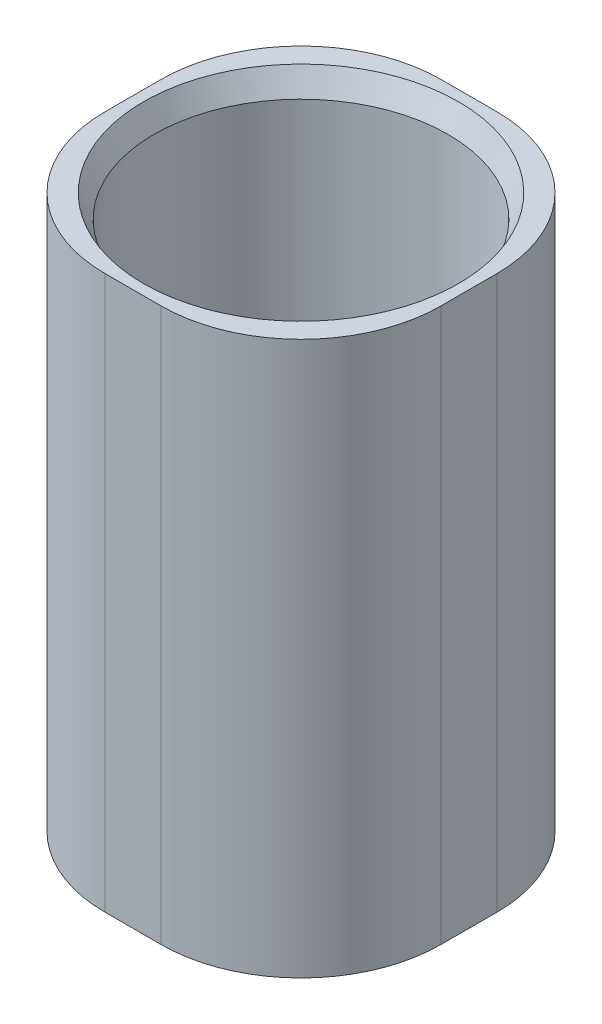
ISO-10303-21;
HEADER;
FILE_DESCRIPTION(('STEP AP214'),'2;1');
FILE_NAME('part.step','',(''),(''),'','','');
FILE_SCHEMA(('AUTOMOTIVE_DESIGN { 1 0 10303 214 1 1 1 1 }'));
ENDSEC;
DATA;
#1=APPLICATION_CONTEXT('core data for automotive mechanical design processes');
#2=APPLICATION_PROTOCOL_DEFINITION('international standard','automotive_design',2000,#1);
#3=PRODUCT_CONTEXT('',#1,'mechanical');
#4=PRODUCT('Part','Part','',(#3));
#5=PRODUCT_RELATED_PRODUCT_CATEGORY('part','',(#4));
#6=PRODUCT_DEFINITION_FORMATION('','',#4);
#7=PRODUCT_DEFINITION_CONTEXT('part definition',#1,'design');
#8=PRODUCT_DEFINITION('design','',#6,#7);
#9=PRODUCT_DEFINITION_SHAPE('','',#8);
#10=(LENGTH_UNIT() NAMED_UNIT(*) SI_UNIT(.MILLI.,.METRE.));
#11=(NAMED_UNIT(*) PLANE_ANGLE_UNIT() SI_UNIT($,.RADIAN.));
#12=(NAMED_UNIT(*) SI_UNIT($,.STERADIAN.) SOLID_ANGLE_UNIT());
#13=UNCERTAINTY_MEASURE_WITH_UNIT(LENGTH_MEASURE(1.E-05),#10,'distance_accuracy_value','');
#14=(GEOMETRIC_REPRESENTATION_CONTEXT(3) GLOBAL_UNCERTAINTY_ASSIGNED_CONTEXT((#13)) GLOBAL_UNIT_ASSIGNED_CONTEXT((#10,
#11,#12)) REPRESENTATION_CONTEXT('',''));
#15=CARTESIAN_POINT('',(0.,0.,0.));
#16=DIRECTION('',(0.,0.,1.));
#17=DIRECTION('',(1.,0.,0.));
#18=AXIS2_PLACEMENT_3D('',#15,#16,#17);
#19=CARTESIAN_POINT('',(12.,40.5,12.));
#20=DIRECTION('',(-1.,0.,0.));
#21=DIRECTION('',(0.,0.,1.));
#22=AXIS2_PLACEMENT_3D('',#19,#20,#21);
#23=PLANE('',#22);
#24=DIRECTION('',(0.,0.,-1.));
#25=VECTOR('',#24,1.);
#26=CARTESIAN_POINT('',(12.,40.5,12.));
#27=LINE('',#26,#25);
#28=CARTESIAN_POINT('',(12.,40.5,2.));
#29=VERTEX_POINT('',#28);
#30=CARTESIAN_POINT('',(12.,40.5,-2.));
#31=VERTEX_POINT('',#30);
#32=EDGE_CURVE('E129',#29,#31,#27,.T.);
#33=ORIENTED_EDGE('',*,*,#32,.F.);
#34=DIRECTION('',(0.,-1.,0.));
#35=VECTOR('',#34,1.);
#36=CARTESIAN_POINT('',(12.,40.5,2.));
#37=LINE('',#36,#35);
#38=CARTESIAN_POINT('',(12.,1.,2.));
#39=VERTEX_POINT('',#38);
#40=EDGE_CURVE('E114',#29,#39,#37,.T.);
#41=ORIENTED_EDGE('',*,*,#40,.T.);
#42=DIRECTION('',(0.,0.,-1.));
#43=VECTOR('',#42,1.);
#44=CARTESIAN_POINT('',(12.,1.,12.));
#45=LINE('',#44,#43);
#46=CARTESIAN_POINT('',(12.,1.,-2.));
#47=VERTEX_POINT('',#46);
#48=EDGE_CURVE('E126',#39,#47,#45,.T.);
#49=ORIENTED_EDGE('',*,*,#48,.T.);
#50=DIRECTION('',(0.,-1.,0.));
#51=VECTOR('',#50,1.);
#52=CARTESIAN_POINT('',(12.,40.5,-2.));
#53=LINE('',#52,#51);
#54=EDGE_CURVE('E131',#47,#31,#53,.F.);
#55=ORIENTED_EDGE('',*,*,#54,.T.);
#56=EDGE_LOOP('',(#33,#41,#49,#55));
#57=FACE_BOUND('',#56,.T.);
#58=ADVANCED_FACE('F44',(#57),#23,.F.);
#59=CARTESIAN_POINT('',(-12.,40.5,-12.));
#60=DIRECTION('',(0.,0.,1.));
#61=DIRECTION('',(1.,0.,0.));
#62=AXIS2_PLACEMENT_3D('',#59,#60,#61);
#63=PLANE('',#62);
#64=DIRECTION('',(-1.,0.,0.));
#65=VECTOR('',#64,1.);
#66=CARTESIAN_POINT('',(-12.,40.5,-12.));
#67=LINE('',#66,#65);
#68=CARTESIAN_POINT('',(2.,40.5,-12.));
#69=VERTEX_POINT('',#68);
#70=CARTESIAN_POINT('',(-2.,40.5,-12.));
#71=VERTEX_POINT('',#70);
#72=EDGE_CURVE('E175',#69,#71,#67,.T.);
#73=ORIENTED_EDGE('',*,*,#72,.F.);
#74=DIRECTION('',(0.,-1.,0.));
#75=VECTOR('',#74,1.);
#76=CARTESIAN_POINT('',(2.,40.5,-12.));
#77=LINE('',#76,#75);
#78=CARTESIAN_POINT('',(2.,1.,-12.));
#79=VERTEX_POINT('',#78);
#80=EDGE_CURVE('E168',#69,#79,#77,.T.);
#81=ORIENTED_EDGE('',*,*,#80,.T.);
#82=DIRECTION('',(-1.,0.,0.));
#83=VECTOR('',#82,1.);
#84=CARTESIAN_POINT('',(-12.,1.,-12.));
#85=LINE('',#84,#83);
#86=CARTESIAN_POINT('',(-2.,1.,-12.));
#87=VERTEX_POINT('',#86);
#88=EDGE_CURVE('E135',#79,#87,#85,.T.);
#89=ORIENTED_EDGE('',*,*,#88,.T.);
#90=DIRECTION('',(0.,-1.,0.));
#91=VECTOR('',#90,1.);
#92=CARTESIAN_POINT('',(-2.,40.5,-12.));
#93=LINE('',#92,#91);
#94=EDGE_CURVE('E166',#87,#71,#93,.F.);
#95=ORIENTED_EDGE('',*,*,#94,.T.);
#96=EDGE_LOOP('',(#73,#81,#89,#95));
#97=FACE_BOUND('',#96,.T.);
#98=ADVANCED_FACE('F173',(#97),#63,.F.);
#99=CARTESIAN_POINT('',(-12.,40.5,12.));
#100=DIRECTION('',(1.,0.,0.));
#101=DIRECTION('',(0.,0.,-1.));
#102=AXIS2_PLACEMENT_3D('',#99,#100,#101);
#103=PLANE('',#102);
#104=DIRECTION('',(0.,0.,1.));
#105=VECTOR('',#104,1.);
#106=CARTESIAN_POINT('',(-12.,40.5,12.));
#107=LINE('',#106,#105);
#108=CARTESIAN_POINT('',(-12.,40.5,-2.));
#109=VERTEX_POINT('',#108);
#110=CARTESIAN_POINT('',(-12.,40.5,2.));
#111=VERTEX_POINT('',#110);
#112=EDGE_CURVE('E183',#109,#111,#107,.T.);
#113=ORIENTED_EDGE('',*,*,#112,.F.);
#114=DIRECTION('',(0.,-1.,0.));
#115=VECTOR('',#114,1.);
#116=CARTESIAN_POINT('',(-12.,40.5,-2.));
#117=LINE('',#116,#115);
#118=CARTESIAN_POINT('',(-12.,1.,-2.));
#119=VERTEX_POINT('',#118);
#120=EDGE_CURVE('E11',#109,#119,#117,.T.);
#121=ORIENTED_EDGE('',*,*,#120,.T.);
#122=DIRECTION('',(0.,0.,1.));
#123=VECTOR('',#122,1.);
#124=CARTESIAN_POINT('',(-12.,1.,12.));
#125=LINE('',#124,#123);
#126=CARTESIAN_POINT('',(-12.,1.,2.));
#127=VERTEX_POINT('',#126);
#128=EDGE_CURVE('E139',#119,#127,#125,.T.);
#129=ORIENTED_EDGE('',*,*,#128,.T.);
#130=DIRECTION('',(0.,-1.,0.));
#131=VECTOR('',#130,1.);
#132=CARTESIAN_POINT('',(-12.,40.5,2.));
#133=LINE('',#132,#131);
#134=EDGE_CURVE('E52',#127,#111,#133,.F.);
#135=ORIENTED_EDGE('',*,*,#134,.T.);
#136=EDGE_LOOP('',(#113,#121,#129,#135));
#137=FACE_BOUND('',#136,.T.);
#138=ADVANCED_FACE('F182',(#137),#103,.F.);
#139=CARTESIAN_POINT('',(-12.,40.5,12.));
#140=DIRECTION('',(0.,0.,-1.));
#141=DIRECTION('',(-1.,0.,0.));
#142=AXIS2_PLACEMENT_3D('',#139,#140,#141);
#143=PLANE('',#142);
#144=DIRECTION('',(1.,0.,0.));
#145=VECTOR('',#144,1.);
#146=CARTESIAN_POINT('',(-12.,1.,12.));
#147=LINE('',#146,#145);
#148=CARTESIAN_POINT('',(-2.,1.,12.));
#149=VERTEX_POINT('',#148);
#150=CARTESIAN_POINT('',(2.,1.,12.));
#151=VERTEX_POINT('',#150);
#152=EDGE_CURVE('E149',#149,#151,#147,.T.);
#153=ORIENTED_EDGE('',*,*,#152,.T.);
#154=DIRECTION('',(0.,-1.,0.));
#155=VECTOR('',#154,1.);
#156=CARTESIAN_POINT('',(2.,40.5,12.));
#157=LINE('',#156,#155);
#158=CARTESIAN_POINT('',(2.,40.5,12.));
#159=VERTEX_POINT('',#158);
#160=EDGE_CURVE('E115',#151,#159,#157,.F.);
#161=ORIENTED_EDGE('',*,*,#160,.T.);
#162=DIRECTION('',(1.,0.,0.));
#163=VECTOR('',#162,1.);
#164=CARTESIAN_POINT('',(-12.,40.5,12.));
#165=LINE('',#164,#163);
#166=CARTESIAN_POINT('',(-2.,40.5,12.));
#167=VERTEX_POINT('',#166);
#168=EDGE_CURVE('E145',#167,#159,#165,.T.);
#169=ORIENTED_EDGE('',*,*,#168,.F.);
#170=DIRECTION('',(0.,-1.,0.));
#171=VECTOR('',#170,1.);
#172=CARTESIAN_POINT('',(-2.,40.5,12.));
#173=LINE('',#172,#171);
#174=EDGE_CURVE('E120',#167,#149,#173,.T.);
#175=ORIENTED_EDGE('',*,*,#174,.T.);
#176=EDGE_LOOP('',(#153,#161,#169,#175));
#177=FACE_BOUND('',#176,.T.);
#178=ADVANCED_FACE('F237',(#177),#143,.F.);
#179=CARTESIAN_POINT('',(0.,40.5,0.));
#180=DIRECTION('',(0.,-1.,0.));
#181=DIRECTION('',(0.,0.,-1.));
#182=AXIS2_PLACEMENT_3D('',#179,#180,#181);
#183=PLANE('',#182);
#184=CARTESIAN_POINT('',(0.,40.5,0.));
#185=DIRECTION('',(0.,-1.,0.));
#186=DIRECTION('',(0.,0.,-1.));
#187=AXIS2_PLACEMENT_3D('',#184,#185,#186);
#188=CIRCLE('',#187,11.25);
#189=CARTESIAN_POINT('',(0.,40.5,-11.25));
#190=VERTEX_POINT('',#189);
#191=EDGE_CURVE('E142',#190,#190,#188,.T.);
#192=ORIENTED_EDGE('',*,*,#191,.T.);
#193=EDGE_LOOP('',(#192));
#194=FACE_BOUND('',#193,.T.);
#195=ORIENTED_EDGE('',*,*,#168,.T.);
#196=CARTESIAN_POINT('',(2.,40.5,2.));
#197=DIRECTION('',(0.,-1.,0.));
#198=DIRECTION('',(0.,0.,-1.));
#199=AXIS2_PLACEMENT_3D('',#196,#197,#198);
#200=CIRCLE('',#199,10.);
#201=EDGE_CURVE('E164',#159,#29,#200,.F.);
#202=ORIENTED_EDGE('',*,*,#201,.T.);
#203=ORIENTED_EDGE('',*,*,#32,.T.);
#204=CARTESIAN_POINT('',(2.,40.5,-2.));
#205=DIRECTION('',(0.,-1.,0.));
#206=DIRECTION('',(0.,0.,-1.));
#207=AXIS2_PLACEMENT_3D('',#204,#205,#206);
#208=CIRCLE('',#207,10.);
#209=EDGE_CURVE('E162',#31,#69,#208,.F.);
#210=ORIENTED_EDGE('',*,*,#209,.T.);
#211=ORIENTED_EDGE('',*,*,#72,.T.);
#212=CARTESIAN_POINT('',(-2.,40.5,-2.));
#213=DIRECTION('',(0.,-1.,0.));
#214=DIRECTION('',(0.,0.,-1.));
#215=AXIS2_PLACEMENT_3D('',#212,#213,#214);
#216=CIRCLE('',#215,10.);
#217=EDGE_CURVE('E65',#71,#109,#216,.F.);
#218=ORIENTED_EDGE('',*,*,#217,.T.);
#219=ORIENTED_EDGE('',*,*,#112,.T.);
#220=CARTESIAN_POINT('',(-2.,40.5,2.));
#221=DIRECTION('',(0.,-1.,0.));
#222=DIRECTION('',(0.,0.,-1.));
#223=AXIS2_PLACEMENT_3D('',#220,#221,#222);
#224=CIRCLE('',#223,10.);
#225=EDGE_CURVE('E159',#111,#167,#224,.F.);
#226=ORIENTED_EDGE('',*,*,#225,.T.);
#227=EDGE_LOOP('',(#195,#202,#203,#210,#211,#218,#219,#226));
#228=FACE_BOUND('',#227,.T.);
#229=ADVANCED_FACE('F198',(#194,#228),#183,.F.);
#230=CARTESIAN_POINT('',(0.,1.,0.));
#231=DIRECTION('',(0.,-1.,0.));
#232=DIRECTION('',(0.,0.,-1.));
#233=AXIS2_PLACEMENT_3D('',#230,#231,#232);
#234=PLANE('',#233);
#235=CARTESIAN_POINT('',(0.,1.,0.));
#236=DIRECTION('',(0.,-1.,0.));
#237=DIRECTION('',(0.,0.,-1.));
#238=AXIS2_PLACEMENT_3D('',#235,#236,#237);
#239=CIRCLE('',#238,1.05);
#240=CARTESIAN_POINT('',(0.,1.,1.05));
#241=VERTEX_POINT('',#240);
#242=EDGE_CURVE('E136',#241,#241,#239,.T.);
#243=ORIENTED_EDGE('',*,*,#242,.F.);
#244=EDGE_LOOP('',(#243));
#245=FACE_BOUND('',#244,.T.);
#246=ORIENTED_EDGE('',*,*,#48,.F.);
#247=CARTESIAN_POINT('',(2.,1.,2.));
#248=DIRECTION('',(0.,-1.,0.));
#249=DIRECTION('',(0.,0.,-1.));
#250=AXIS2_PLACEMENT_3D('',#247,#248,#249);
#251=CIRCLE('',#250,10.);
#252=EDGE_CURVE('E110',#39,#151,#251,.T.);
#253=ORIENTED_EDGE('',*,*,#252,.T.);
#254=ORIENTED_EDGE('',*,*,#152,.F.);
#255=CARTESIAN_POINT('',(-2.,1.,2.));
#256=DIRECTION('',(0.,-1.,0.));
#257=DIRECTION('',(0.,0.,-1.));
#258=AXIS2_PLACEMENT_3D('',#255,#256,#257);
#259=CIRCLE('',#258,10.);
#260=EDGE_CURVE('E130',#149,#127,#259,.T.);
#261=ORIENTED_EDGE('',*,*,#260,.T.);
#262=ORIENTED_EDGE('',*,*,#128,.F.);
#263=CARTESIAN_POINT('',(-2.,1.,-2.));
#264=DIRECTION('',(0.,-1.,0.));
#265=DIRECTION('',(0.,0.,-1.));
#266=AXIS2_PLACEMENT_3D('',#263,#264,#265);
#267=CIRCLE('',#266,10.);
#268=EDGE_CURVE('E153',#119,#87,#267,.T.);
#269=ORIENTED_EDGE('',*,*,#268,.T.);
#270=ORIENTED_EDGE('',*,*,#88,.F.);
#271=CARTESIAN_POINT('',(2.,1.,-2.));
#272=DIRECTION('',(0.,-1.,0.));
#273=DIRECTION('',(0.,0.,-1.));
#274=AXIS2_PLACEMENT_3D('',#271,#272,#273);
#275=CIRCLE('',#274,10.);
#276=EDGE_CURVE('E121',#79,#47,#275,.T.);
#277=ORIENTED_EDGE('',*,*,#276,.T.);
#278=EDGE_LOOP('',(#246,#253,#254,#261,#262,#269,#270,#277));
#279=FACE_BOUND('',#278,.T.);
#280=ADVANCED_FACE('F133',(#245,#279),#234,.T.);
#281=CARTESIAN_POINT('',(0.,0.,0.));
#282=DIRECTION('',(0.,1.,0.));
#283=DIRECTION('',(0.,0.,1.));
#284=AXIS2_PLACEMENT_3D('',#281,#282,#283);
#285=CONICAL_SURFACE('',#284,0.,0.809783572570167);
#286=CARTESIAN_POINT('',(0.,10.,0.));
#287=DIRECTION('',(0.,-1.,0.));
#288=DIRECTION('',(0.,0.,-1.));
#289=AXIS2_PLACEMENT_3D('',#286,#287,#288);
#290=CIRCLE('',#289,10.5);
#291=CARTESIAN_POINT('',(0.,10.,10.5));
#292=VERTEX_POINT('',#291);
#293=EDGE_CURVE('E192',#292,#292,#290,.T.);
#294=CARTESIAN_POINT('',(0.,1.,1.05));
#295=CARTESIAN_POINT('',(0.,1.09375,1.1484375));
#296=CARTESIAN_POINT('',(0.,1.1875,1.246875));
#297=CARTESIAN_POINT('',(0.,1.375,1.44375));
#298=CARTESIAN_POINT('',(0.,1.46875,1.5421875));
#299=CARTESIAN_POINT('',(0.,1.65625,1.7390625));
#300=CARTESIAN_POINT('',(0.,1.75,1.8375));
#301=CARTESIAN_POINT('',(0.,1.9375,2.034375));
#302=CARTESIAN_POINT('',(0.,2.03125,2.1328125));
#303=CARTESIAN_POINT('',(0.,2.21875,2.3296875));
#304=CARTESIAN_POINT('',(0.,2.3125,2.428125));
#305=CARTESIAN_POINT('',(0.,2.5,2.625));
#306=CARTESIAN_POINT('',(0.,2.59375,2.7234375));
#307=CARTESIAN_POINT('',(0.,2.78125,2.9203125));
#308=CARTESIAN_POINT('',(0.,2.875,3.01875));
#309=CARTESIAN_POINT('',(0.,3.0625,3.215625));
#310=CARTESIAN_POINT('',(0.,3.15625,3.3140625));
#311=CARTESIAN_POINT('',(0.,3.34375,3.5109375));
#312=CARTESIAN_POINT('',(0.,3.4375,3.609375));
#313=CARTESIAN_POINT('',(0.,3.625,3.80625));
#314=CARTESIAN_POINT('',(0.,3.71875,3.9046875));
#315=CARTESIAN_POINT('',(0.,3.90625,4.1015625));
#316=CARTESIAN_POINT('',(0.,4.,4.2));
#317=CARTESIAN_POINT('',(0.,4.1875,4.396875));
#318=CARTESIAN_POINT('',(0.,4.28125,4.4953125));
#319=CARTESIAN_POINT('',(0.,4.46875,4.6921875));
#320=CARTESIAN_POINT('',(0.,4.5625,4.790625));
#321=CARTESIAN_POINT('',(0.,4.75,4.9875));
#322=CARTESIAN_POINT('',(0.,4.84375,5.0859375));
#323=CARTESIAN_POINT('',(0.,5.03125,5.2828125));
#324=CARTESIAN_POINT('',(0.,5.125,5.38125));
#325=CARTESIAN_POINT('',(0.,5.3125,5.578125));
#326=CARTESIAN_POINT('',(0.,5.40625,5.6765625));
#327=CARTESIAN_POINT('',(0.,5.59375,5.8734375));
#328=CARTESIAN_POINT('',(0.,5.6875,5.971875));
#329=CARTESIAN_POINT('',(0.,5.875,6.16875));
#330=CARTESIAN_POINT('',(0.,5.96875,6.2671875));
#331=CARTESIAN_POINT('',(0.,6.15625,6.4640625));
#332=CARTESIAN_POINT('',(0.,6.25,6.5625));
#333=CARTESIAN_POINT('',(0.,6.4375,6.759375));
#334=CARTESIAN_POINT('',(0.,6.53125,6.8578125));
#335=CARTESIAN_POINT('',(0.,6.71875,7.0546875));
#336=CARTESIAN_POINT('',(0.,6.8125,7.153125));
#337=CARTESIAN_POINT('',(0.,7.,7.35));
#338=CARTESIAN_POINT('',(0.,7.09375,7.4484375));
#339=CARTESIAN_POINT('',(0.,7.28125,7.6453125));
#340=CARTESIAN_POINT('',(0.,7.375,7.74375));
#341=CARTESIAN_POINT('',(0.,7.5625,7.940625));
#342=CARTESIAN_POINT('',(0.,7.65625,8.0390625));
#343=CARTESIAN_POINT('',(0.,7.84375,8.2359375));
#344=CARTESIAN_POINT('',(0.,7.9375,8.334375));
#345=CARTESIAN_POINT('',(0.,8.125,8.53125));
#346=CARTESIAN_POINT('',(0.,8.21875,8.6296875));
#347=CARTESIAN_POINT('',(0.,8.40625,8.8265625));
#348=CARTESIAN_POINT('',(0.,8.5,8.925));
#349=CARTESIAN_POINT('',(0.,8.6875,9.121875));
#350=CARTESIAN_POINT('',(0.,8.78125,9.2203125));
#351=CARTESIAN_POINT('',(0.,8.96875,9.4171875));
#352=CARTESIAN_POINT('',(0.,9.0625,9.515625));
#353=CARTESIAN_POINT('',(0.,9.25,9.7125));
#354=CARTESIAN_POINT('',(0.,9.34375,9.8109375));
#355=CARTESIAN_POINT('',(0.,9.53125,10.0078125));
#356=CARTESIAN_POINT('',(0.,9.625,10.10625));
#357=CARTESIAN_POINT('',(0.,9.8125,10.303125));
#358=CARTESIAN_POINT('',(0.,9.90625,10.4015625));
#359=CARTESIAN_POINT('',(0.,10.,10.5));
#360=B_SPLINE_CURVE_WITH_KNOTS('',3,(#294,#295,#296,#297,#298,#299,#300,#301,#302,#303,#304,
#305,#306,#307,#308,#309,#310,#311,#312,#313,#314,#315,#316,#317,#318,#319,#320,#321,#322,#323,
#324,#325,#326,#327,#328,#329,#330,#331,#332,#333,#334,#335,#336,#337,#338,#339,#340,#341,#342,
#343,#344,#345,#346,#347,#348,#349,#350,#351,#352,#353,#354,#355,#356,#357,#358,#359),
.UNSPECIFIED.,.F.,.F.,(4,2,2,2,2,2,2,2,2,2,2,2,2,2,2,2,2,2,2,2,2,2,2,2,2,2,2,2,2,2,2,2,4),(0.,
0.4078125,0.815625,1.2234375,1.63125,2.0390625,2.446875,2.8546875,3.2625,3.6703125,4.078125,
4.4859375,4.89375,5.3015625,5.709375,6.1171875,6.525,6.9328125,7.340625,7.7484375,8.15625,
8.5640625,8.971875,9.3796875,9.7875,10.1953125,10.603125,11.0109375,11.41875,11.8265625,
12.234375,12.6421875,13.05),.UNSPECIFIED.);
#361=EDGE_CURVE('BSEAM211',#241,#292,#360,.T.);
#362=ORIENTED_EDGE('',*,*,#242,.T.);
#363=ORIENTED_EDGE('',*,*,#293,.F.);
#364=ORIENTED_EDGE('',*,*,#361,.T.);
#365=ORIENTED_EDGE('',*,*,#361,.F.);
#366=EDGE_LOOP('',(#362,#364,#363,#365));
#367=FACE_BOUND('',#366,.T.);
#368=ADVANCED_FACE('F211',(#367),#285,.F.);
#369=CARTESIAN_POINT('',(0.,0.,0.));
#370=DIRECTION('',(0.,-1.,0.));
#371=DIRECTION('',(0.,0.,-1.));
#372=AXIS2_PLACEMENT_3D('',#369,#370,#371);
#373=CYLINDRICAL_SURFACE('',#372,10.5);
#374=CARTESIAN_POINT('',(0.,38.8571428571429,0.));
#375=DIRECTION('',(0.,-1.,0.));
#376=DIRECTION('',(0.,0.,-1.));
#377=AXIS2_PLACEMENT_3D('',#374,#375,#376);
#378=CIRCLE('',#377,10.5);
#379=CARTESIAN_POINT('',(0.,38.8571428571429,-10.5));
#380=VERTEX_POINT('',#379);
#381=EDGE_CURVE('E189',#380,#380,#378,.T.);
#382=ORIENTED_EDGE('',*,*,#381,.F.);
#383=EDGE_LOOP('',(#382));
#384=FACE_BOUND('',#383,.T.);
#385=ORIENTED_EDGE('',*,*,#293,.T.);
#386=EDGE_LOOP('',(#385));
#387=FACE_BOUND('',#386,.T.);
#388=ADVANCED_FACE('F202',(#384,#387),#373,.F.);
#389=CARTESIAN_POINT('',(0.,40.5,0.));
#390=DIRECTION('',(0.,1.,0.));
#391=DIRECTION('',(0.,0.,1.));
#392=AXIS2_PLACEMENT_3D('',#389,#390,#391);
#393=CONICAL_SURFACE('',#392,11.25,0.428264152876656);
#394=ORIENTED_EDGE('',*,*,#381,.T.);
#395=EDGE_LOOP('',(#394));
#396=FACE_BOUND('',#395,.T.);
#397=ORIENTED_EDGE('',*,*,#191,.F.);
#398=EDGE_LOOP('',(#397));
#399=FACE_BOUND('',#398,.T.);
#400=ADVANCED_FACE('F200',(#396,#399),#393,.F.);
#401=CARTESIAN_POINT('',(2.,40.5,2.));
#402=DIRECTION('',(0.,-1.,0.));
#403=DIRECTION('',(0.,0.,-1.));
#404=AXIS2_PLACEMENT_3D('',#401,#402,#403);
#405=CYLINDRICAL_SURFACE('',#404,10.);
#406=ORIENTED_EDGE('',*,*,#201,.F.);
#407=ORIENTED_EDGE('',*,*,#160,.F.);
#408=ORIENTED_EDGE('',*,*,#252,.F.);
#409=ORIENTED_EDGE('',*,*,#40,.F.);
#410=EDGE_LOOP('',(#406,#407,#408,#409));
#411=FACE_BOUND('',#410,.T.);
#412=ADVANCED_FACE('F113',(#411),#405,.T.);
#413=CARTESIAN_POINT('',(2.,40.5,-2.));
#414=DIRECTION('',(0.,-1.,0.));
#415=DIRECTION('',(0.,0.,-1.));
#416=AXIS2_PLACEMENT_3D('',#413,#414,#415);
#417=CYLINDRICAL_SURFACE('',#416,10.);
#418=ORIENTED_EDGE('',*,*,#209,.F.);
#419=ORIENTED_EDGE('',*,*,#54,.F.);
#420=ORIENTED_EDGE('',*,*,#276,.F.);
#421=ORIENTED_EDGE('',*,*,#80,.F.);
#422=EDGE_LOOP('',(#418,#419,#420,#421));
#423=FACE_BOUND('',#422,.T.);
#424=ADVANCED_FACE('F209',(#423),#417,.T.);
#425=CARTESIAN_POINT('',(-2.,40.5,-2.));
#426=DIRECTION('',(0.,-1.,0.));
#427=DIRECTION('',(0.,0.,-1.));
#428=AXIS2_PLACEMENT_3D('',#425,#426,#427);
#429=CYLINDRICAL_SURFACE('',#428,10.);
#430=ORIENTED_EDGE('',*,*,#217,.F.);
#431=ORIENTED_EDGE('',*,*,#94,.F.);
#432=ORIENTED_EDGE('',*,*,#268,.F.);
#433=ORIENTED_EDGE('',*,*,#120,.F.);
#434=EDGE_LOOP('',(#430,#431,#432,#433));
#435=FACE_BOUND('',#434,.T.);
#436=ADVANCED_FACE('F181',(#435),#429,.T.);
#437=CARTESIAN_POINT('',(-2.,40.5,2.));
#438=DIRECTION('',(0.,-1.,0.));
#439=DIRECTION('',(0.,0.,-1.));
#440=AXIS2_PLACEMENT_3D('',#437,#438,#439);
#441=CYLINDRICAL_SURFACE('',#440,10.);
#442=ORIENTED_EDGE('',*,*,#225,.F.);
#443=ORIENTED_EDGE('',*,*,#134,.F.);
#444=ORIENTED_EDGE('',*,*,#260,.F.);
#445=ORIENTED_EDGE('',*,*,#174,.F.);
#446=EDGE_LOOP('',(#442,#443,#444,#445));
#447=FACE_BOUND('',#446,.T.);
#448=ADVANCED_FACE('F46',(#447),#441,.T.);
#449=CLOSED_SHELL('',(#58,#98,#138,#178,#229,#280,#368,#388,#400,#412,#424,#436,#448));
#450=MANIFOLD_SOLID_BREP('B2',#449);
#451=ADVANCED_BREP_SHAPE_REPRESENTATION('',(#18,#450),#14);
#452=SHAPE_DEFINITION_REPRESENTATION(#9,#451);
ENDSEC;
END-ISO-10303-21;
